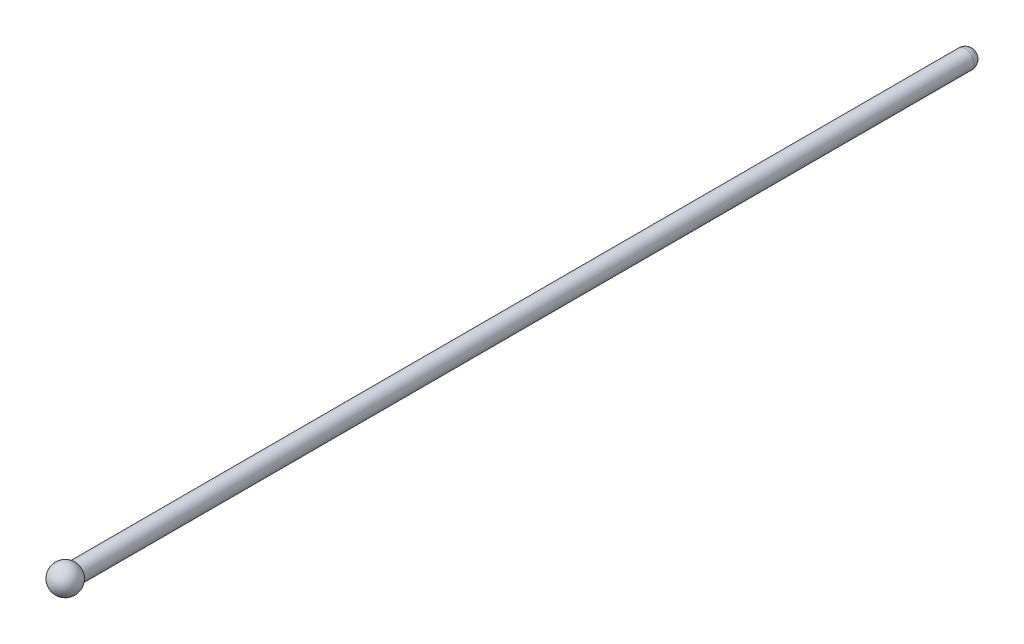
ISO-10303-21;
HEADER;
FILE_DESCRIPTION(('STEP AP214'),'2;1');
FILE_NAME('part.step','',(''),(''),'','','');
FILE_SCHEMA(('AUTOMOTIVE_DESIGN { 1 0 10303 214 1 1 1 1 }'));
ENDSEC;
DATA;
#1=APPLICATION_CONTEXT('core data for automotive mechanical design processes');
#2=APPLICATION_PROTOCOL_DEFINITION('international standard','automotive_design',2000,#1);
#3=PRODUCT_CONTEXT('',#1,'mechanical');
#4=PRODUCT('Part','Part','',(#3));
#5=PRODUCT_RELATED_PRODUCT_CATEGORY('part','',(#4));
#6=PRODUCT_DEFINITION_FORMATION('','',#4);
#7=PRODUCT_DEFINITION_CONTEXT('part definition',#1,'design');
#8=PRODUCT_DEFINITION('design','',#6,#7);
#9=PRODUCT_DEFINITION_SHAPE('','',#8);
#10=(LENGTH_UNIT() NAMED_UNIT(*) SI_UNIT(.MILLI.,.METRE.));
#11=(NAMED_UNIT(*) PLANE_ANGLE_UNIT() SI_UNIT($,.RADIAN.));
#12=(NAMED_UNIT(*) SI_UNIT($,.STERADIAN.) SOLID_ANGLE_UNIT());
#13=UNCERTAINTY_MEASURE_WITH_UNIT(LENGTH_MEASURE(1.E-05),#10,'distance_accuracy_value','');
#14=(GEOMETRIC_REPRESENTATION_CONTEXT(3) GLOBAL_UNCERTAINTY_ASSIGNED_CONTEXT((#13)) GLOBAL_UNIT_ASSIGNED_CONTEXT((#10,
#11,#12)) REPRESENTATION_CONTEXT('',''));
#15=CARTESIAN_POINT('',(0.,0.,0.));
#16=DIRECTION('',(0.,0.,1.));
#17=DIRECTION('',(1.,0.,0.));
#18=AXIS2_PLACEMENT_3D('',#15,#16,#17);
#19=CARTESIAN_POINT('',(0.,0.,50.));
#20=DIRECTION('',(0.,0.,-1.));
#21=DIRECTION('',(-1.,0.,0.));
#22=AXIS2_PLACEMENT_3D('',#19,#20,#21);
#23=CYLINDRICAL_SURFACE('',#22,0.5);
#24=CARTESIAN_POINT('',(0.,0.,0.5));
#25=DIRECTION('',(0.,0.,-1.));
#26=DIRECTION('',(-1.,0.,0.));
#27=AXIS2_PLACEMENT_3D('',#24,#25,#26);
#28=CIRCLE('',#27,0.5);
#29=CARTESIAN_POINT('',(-0.5,0.,0.5));
#30=VERTEX_POINT('',#29);
#31=EDGE_CURVE('E10',#30,#30,#28,.F.);
#32=ORIENTED_EDGE('',*,*,#31,.T.);
#33=EDGE_LOOP('',(#32));
#34=FACE_BOUND('',#33,.T.);
#35=CARTESIAN_POINT('',(0.,0.,49.4409830056251));
#36=DIRECTION('',(0.,0.,0.999999999999997));
#37=DIRECTION('',(1.,0.,0.));
#38=AXIS2_PLACEMENT_3D('',#35,#36,#37);
#39=CIRCLE('',#38,0.5);
#40=CARTESIAN_POINT('',(0.5,0.,49.4409830056251));
#41=VERTEX_POINT('',#40);
#42=EDGE_CURVE('E51',#41,#41,#39,.T.);
#43=ORIENTED_EDGE('',*,*,#42,.F.);
#44=EDGE_LOOP('',(#43));
#45=FACE_BOUND('',#44,.T.);
#46=ADVANCED_FACE('F43',(#34,#45),#23,.T.);
#47=CARTESIAN_POINT('',(0.,0.,50.));
#48=DIRECTION('',(-1.,0.,0.));
#49=DIRECTION('',(0.,1.,0.));
#50=AXIS2_PLACEMENT_3D('',#47,#48,#49);
#51=SPHERICAL_SURFACE('',#50,0.75);
#52=CARTESIAN_POINT('',(0.,0.,50.));
#53=DIRECTION('',(0.,0.,1.));
#54=DIRECTION('',(1.,0.,0.));
#55=AXIS2_PLACEMENT_3D('',#52,#53,#54);
#56=SPHERICAL_SURFACE('',#55,0.75);
#57=ORIENTED_EDGE('',*,*,#42,.T.);
#58=EDGE_LOOP('',(#57));
#59=FACE_BOUND('',#58,.T.);
#60=ADVANCED_FACE('F58',(#59),#56,.T.);
#61=CARTESIAN_POINT('',(0.,0.,0.5));
#62=DIRECTION('',(0.,0.,1.));
#63=DIRECTION('',(1.,0.,0.));
#64=AXIS2_PLACEMENT_3D('',#61,#62,#63);
#65=SPHERICAL_SURFACE('',#64,0.5);
#66=ORIENTED_EDGE('',*,*,#31,.F.);
#67=EDGE_LOOP('',(#66));
#68=FACE_BOUND('',#67,.T.);
#69=ADVANCED_FACE('F45',(#68),#65,.T.);
#70=CLOSED_SHELL('',(#46,#60,#69));
#71=MANIFOLD_SOLID_BREP('B2',#70);
#72=ADVANCED_BREP_SHAPE_REPRESENTATION('',(#18,#71),#14);
#73=SHAPE_DEFINITION_REPRESENTATION(#9,#72);
ENDSEC;
END-ISO-10303-21;
